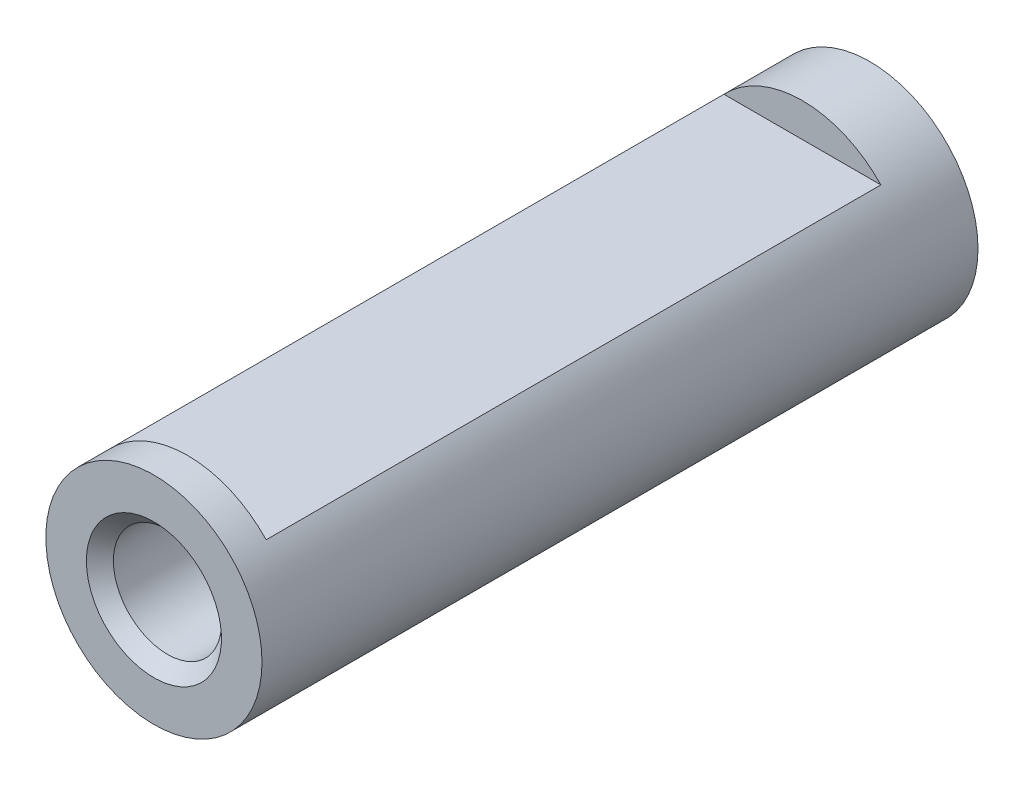
ISO-10303-21;
HEADER;
FILE_DESCRIPTION(('STEP AP214'),'2;1');
FILE_NAME('part.step','',(''),(''),'','','');
FILE_SCHEMA(('AUTOMOTIVE_DESIGN { 1 0 10303 214 1 1 1 1 }'));
ENDSEC;
DATA;
#1=APPLICATION_CONTEXT('core data for automotive mechanical design processes');
#2=APPLICATION_PROTOCOL_DEFINITION('international standard','automotive_design',2000,#1);
#3=PRODUCT_CONTEXT('',#1,'mechanical');
#4=PRODUCT('Part','Part','',(#3));
#5=PRODUCT_RELATED_PRODUCT_CATEGORY('part','',(#4));
#6=PRODUCT_DEFINITION_FORMATION('','',#4);
#7=PRODUCT_DEFINITION_CONTEXT('part definition',#1,'design');
#8=PRODUCT_DEFINITION('design','',#6,#7);
#9=PRODUCT_DEFINITION_SHAPE('','',#8);
#10=(LENGTH_UNIT() NAMED_UNIT(*) SI_UNIT(.MILLI.,.METRE.));
#11=(NAMED_UNIT(*) PLANE_ANGLE_UNIT() SI_UNIT($,.RADIAN.));
#12=(NAMED_UNIT(*) SI_UNIT($,.STERADIAN.) SOLID_ANGLE_UNIT());
#13=UNCERTAINTY_MEASURE_WITH_UNIT(LENGTH_MEASURE(1.E-05),#10,'distance_accuracy_value','');
#14=(GEOMETRIC_REPRESENTATION_CONTEXT(3) GLOBAL_UNCERTAINTY_ASSIGNED_CONTEXT((#13)) GLOBAL_UNIT_ASSIGNED_CONTEXT((#10,
#11,#12)) REPRESENTATION_CONTEXT('',''));
#15=CARTESIAN_POINT('',(0.,0.,0.));
#16=DIRECTION('',(0.,0.,1.));
#17=DIRECTION('',(1.,0.,0.));
#18=AXIS2_PLACEMENT_3D('',#15,#16,#17);
#19=CARTESIAN_POINT('',(0.,0.,35.8991596638655));
#20=DIRECTION('',(0.,0.,1.));
#21=DIRECTION('',(1.,0.,0.));
#22=AXIS2_PLACEMENT_3D('',#19,#20,#21);
#23=CYLINDRICAL_SURFACE('',#22,4.);
#24=CARTESIAN_POINT('',(0.,0.,25.5));
#25=DIRECTION('',(0.,0.,-1.));
#26=DIRECTION('',(-1.,0.,0.));
#27=AXIS2_PLACEMENT_3D('',#24,#25,#26);
#28=CIRCLE('',#27,4.);
#29=CARTESIAN_POINT('',(-4.,0.,25.5));
#30=VERTEX_POINT('',#29);
#31=EDGE_CURVE('E88',#30,#30,#28,.F.);
#32=ORIENTED_EDGE('',*,*,#31,.T.);
#33=EDGE_LOOP('',(#32));
#34=FACE_BOUND('',#33,.T.);
#35=CARTESIAN_POINT('',(0.,0.,-26.5));
#36=DIRECTION('',(0.,0.,1.));
#37=DIRECTION('',(1.,0.,0.));
#38=AXIS2_PLACEMENT_3D('',#35,#36,#37);
#39=CIRCLE('',#38,4.);
#40=CARTESIAN_POINT('',(4.,0.,-26.5));
#41=VERTEX_POINT('',#40);
#42=EDGE_CURVE('E76',#41,#41,#39,.T.);
#43=ORIENTED_EDGE('',*,*,#42,.F.);
#44=EDGE_LOOP('',(#43));
#45=FACE_BOUND('',#44,.T.);
#46=ADVANCED_FACE('F37',(#34,#45),#23,.F.);
#47=CARTESIAN_POINT('',(0.,3.99999999999999,26.5));
#48=DIRECTION('',(0.,0.,-1.));
#49=DIRECTION('',(-1.,0.,0.));
#50=AXIS2_PLACEMENT_3D('',#47,#48,#49);
#51=PLANE('',#50);
#52=CARTESIAN_POINT('',(0.,0.,26.5));
#53=DIRECTION('',(0.,0.,-1.));
#54=DIRECTION('',(-1.,0.,0.));
#55=AXIS2_PLACEMENT_3D('',#52,#53,#54);
#56=CIRCLE('',#55,5.);
#57=CARTESIAN_POINT('',(-5.,0.,26.5));
#58=VERTEX_POINT('',#57);
#59=EDGE_CURVE('E91',#58,#58,#56,.T.);
#60=ORIENTED_EDGE('',*,*,#59,.T.);
#61=EDGE_LOOP('',(#60));
#62=FACE_BOUND('',#61,.T.);
#63=CARTESIAN_POINT('',(0.,0.,26.5));
#64=DIRECTION('',(0.,0.,1.));
#65=DIRECTION('',(1.,0.,0.));
#66=AXIS2_PLACEMENT_3D('',#63,#64,#65);
#67=CIRCLE('',#66,8.);
#68=CARTESIAN_POINT('',(8.,0.,26.5));
#69=VERTEX_POINT('',#68);
#70=EDGE_CURVE('E85',#69,#69,#67,.T.);
#71=ORIENTED_EDGE('',*,*,#70,.T.);
#72=EDGE_LOOP('',(#71));
#73=FACE_BOUND('',#72,.T.);
#74=ADVANCED_FACE('F96',(#62,#73),#51,.F.);
#75=CARTESIAN_POINT('',(0.,0.,35.8991596638655));
#76=DIRECTION('',(0.,0.,1.));
#77=DIRECTION('',(1.,0.,0.));
#78=AXIS2_PLACEMENT_3D('',#75,#76,#77);
#79=CYLINDRICAL_SURFACE('',#78,8.);
#80=CARTESIAN_POINT('',(0.,0.,-21.5));
#81=DIRECTION('',(0.,0.,-1.));
#82=DIRECTION('',(-1.,0.,0.));
#83=AXIS2_PLACEMENT_3D('',#80,#81,#82);
#84=CIRCLE('',#83,8.);
#85=CARTESIAN_POINT('',(-5.80947501931113,5.5,-21.5));
#86=VERTEX_POINT('',#85);
#87=CARTESIAN_POINT('',(5.80947501931113,5.5,-21.5));
#88=VERTEX_POINT('',#87);
#89=EDGE_CURVE('E67',#86,#88,#84,.T.);
#90=ORIENTED_EDGE('',*,*,#89,.T.);
#91=DIRECTION('',(0.,0.,1.));
#92=VECTOR('',#91,1.);
#93=CARTESIAN_POINT('',(5.80947501931113,5.5,35.8991596638655));
#94=LINE('',#93,#92);
#95=CARTESIAN_POINT('',(5.80947501931113,5.5,24.));
#96=VERTEX_POINT('',#95);
#97=EDGE_CURVE('E11',#88,#96,#94,.T.);
#98=ORIENTED_EDGE('',*,*,#97,.T.);
#99=CARTESIAN_POINT('',(0.,0.,24.));
#100=DIRECTION('',(0.,0.,1.));
#101=DIRECTION('',(1.,0.,0.));
#102=AXIS2_PLACEMENT_3D('',#99,#100,#101);
#103=CIRCLE('',#102,8.);
#104=CARTESIAN_POINT('',(-5.80947501931113,5.5,24.));
#105=VERTEX_POINT('',#104);
#106=EDGE_CURVE('E46',#96,#105,#103,.T.);
#107=ORIENTED_EDGE('',*,*,#106,.T.);
#108=DIRECTION('',(0.,0.,1.));
#109=VECTOR('',#108,1.);
#110=CARTESIAN_POINT('',(-5.80947501931113,5.5,35.8991596638655));
#111=LINE('',#110,#109);
#112=EDGE_CURVE('E70',#105,#86,#111,.F.);
#113=ORIENTED_EDGE('',*,*,#112,.T.);
#114=EDGE_LOOP('',(#90,#98,#107,#113));
#115=FACE_BOUND('',#114,.T.);
#116=ORIENTED_EDGE('',*,*,#70,.F.);
#117=EDGE_LOOP('',(#116));
#118=FACE_BOUND('',#117,.T.);
#119=CARTESIAN_POINT('',(0.,0.,-26.5));
#120=DIRECTION('',(0.,0.,1.));
#121=DIRECTION('',(1.,0.,0.));
#122=AXIS2_PLACEMENT_3D('',#119,#120,#121);
#123=CIRCLE('',#122,8.00000000000001);
#124=CARTESIAN_POINT('',(8.00000000000001,0.,-26.5));
#125=VERTEX_POINT('',#124);
#126=EDGE_CURVE('E79',#125,#125,#123,.T.);
#127=ORIENTED_EDGE('',*,*,#126,.T.);
#128=EDGE_LOOP('',(#127));
#129=FACE_BOUND('',#128,.T.);
#130=ADVANCED_FACE('F68',(#115,#118,#129),#79,.T.);
#131=CARTESIAN_POINT('',(0.,8.00000000000001,-26.5));
#132=DIRECTION('',(0.,0.,1.));
#133=DIRECTION('',(1.,0.,0.));
#134=AXIS2_PLACEMENT_3D('',#131,#132,#133);
#135=PLANE('',#134);
#136=ORIENTED_EDGE('',*,*,#126,.F.);
#137=EDGE_LOOP('',(#136));
#138=FACE_BOUND('',#137,.T.);
#139=ORIENTED_EDGE('',*,*,#42,.T.);
#140=EDGE_LOOP('',(#139));
#141=FACE_BOUND('',#140,.T.);
#142=ADVANCED_FACE('F102',(#138,#141),#135,.F.);
#143=CARTESIAN_POINT('',(0.,0.,25.5));
#144=DIRECTION('',(0.,0.,1.));
#145=DIRECTION('',(1.,0.,0.));
#146=AXIS2_PLACEMENT_3D('',#143,#144,#145);
#147=CONICAL_SURFACE('',#146,4.,0.785398163397452);
#148=ORIENTED_EDGE('',*,*,#59,.F.);
#149=EDGE_LOOP('',(#148));
#150=FACE_BOUND('',#149,.T.);
#151=ORIENTED_EDGE('',*,*,#31,.F.);
#152=EDGE_LOOP('',(#151));
#153=FACE_BOUND('',#152,.T.);
#154=ADVANCED_FACE('F40',(#150,#153),#147,.F.);
#155=CARTESIAN_POINT('',(-8.00000000000001,8.,24.));
#156=DIRECTION('',(0.,0.,1.));
#157=DIRECTION('',(1.,0.,0.));
#158=AXIS2_PLACEMENT_3D('',#155,#156,#157);
#159=PLANE('',#158);
#160=DIRECTION('',(1.,0.,0.));
#161=VECTOR('',#160,1.);
#162=CARTESIAN_POINT('',(-8.00000000000001,5.5,24.));
#163=LINE('',#162,#161);
#164=EDGE_CURVE('E74',#105,#96,#163,.T.);
#165=ORIENTED_EDGE('',*,*,#164,.F.);
#166=ORIENTED_EDGE('',*,*,#106,.F.);
#167=EDGE_LOOP('',(#165,#166));
#168=FACE_BOUND('',#167,.T.);
#169=ADVANCED_FACE('F101',(#168),#159,.F.);
#170=CARTESIAN_POINT('',(-8.00000000000001,5.5,-21.5));
#171=DIRECTION('',(0.,0.,-1.));
#172=DIRECTION('',(-1.,0.,0.));
#173=AXIS2_PLACEMENT_3D('',#170,#171,#172);
#174=PLANE('',#173);
#175=DIRECTION('',(1.,0.,0.));
#176=VECTOR('',#175,1.);
#177=CARTESIAN_POINT('',(-8.00000000000001,5.5,-21.5));
#178=LINE('',#177,#176);
#179=EDGE_CURVE('E53',#86,#88,#178,.T.);
#180=ORIENTED_EDGE('',*,*,#179,.T.);
#181=ORIENTED_EDGE('',*,*,#89,.F.);
#182=EDGE_LOOP('',(#180,#181));
#183=FACE_BOUND('',#182,.T.);
#184=ADVANCED_FACE('F75',(#183),#174,.F.);
#185=CARTESIAN_POINT('',(-8.00000000000001,5.5,24.));
#186=DIRECTION('',(0.,-1.,0.));
#187=DIRECTION('',(0.,0.,-1.));
#188=AXIS2_PLACEMENT_3D('',#185,#186,#187);
#189=PLANE('',#188);
#190=ORIENTED_EDGE('',*,*,#179,.F.);
#191=ORIENTED_EDGE('',*,*,#112,.F.);
#192=ORIENTED_EDGE('',*,*,#164,.T.);
#193=ORIENTED_EDGE('',*,*,#97,.F.);
#194=EDGE_LOOP('',(#190,#191,#192,#193));
#195=FACE_BOUND('',#194,.T.);
#196=ADVANCED_FACE('F73',(#195),#189,.F.);
#197=CLOSED_SHELL('',(#46,#74,#130,#142,#154,#169,#184,#196));
#198=MANIFOLD_SOLID_BREP('B2',#197);
#199=ADVANCED_BREP_SHAPE_REPRESENTATION('',(#18,#198),#14);
#200=SHAPE_DEFINITION_REPRESENTATION(#9,#199);
ENDSEC;
END-ISO-10303-21;
